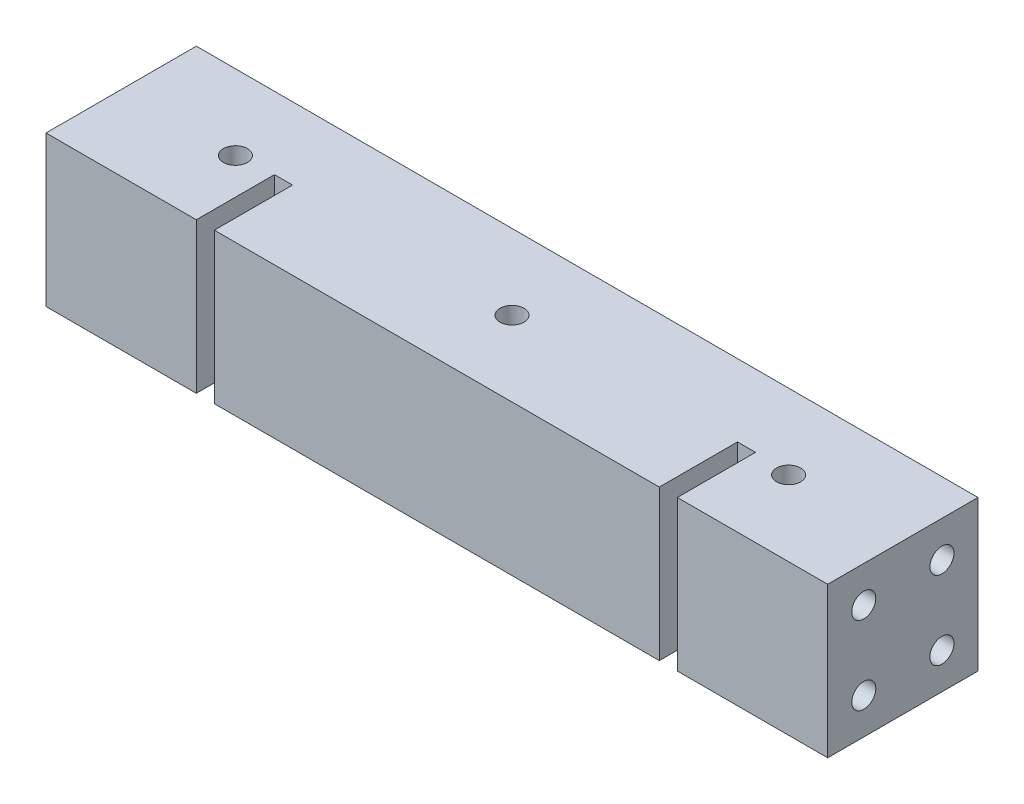
ISO-10303-21;
HEADER;
FILE_DESCRIPTION(('STEP AP214'),'2;1');
FILE_NAME('part.step','',(''),(''),'','','');
FILE_SCHEMA(('AUTOMOTIVE_DESIGN { 1 0 10303 214 1 1 1 1 }'));
ENDSEC;
DATA;
#1=APPLICATION_CONTEXT('core data for automotive mechanical design processes');
#2=APPLICATION_PROTOCOL_DEFINITION('international standard','automotive_design',2000,#1);
#3=PRODUCT_CONTEXT('',#1,'mechanical');
#4=PRODUCT('Part','Part','',(#3));
#5=PRODUCT_RELATED_PRODUCT_CATEGORY('part','',(#4));
#6=PRODUCT_DEFINITION_FORMATION('','',#4);
#7=PRODUCT_DEFINITION_CONTEXT('part definition',#1,'design');
#8=PRODUCT_DEFINITION('design','',#6,#7);
#9=PRODUCT_DEFINITION_SHAPE('','',#8);
#10=(LENGTH_UNIT() NAMED_UNIT(*) SI_UNIT(.MILLI.,.METRE.));
#11=(NAMED_UNIT(*) PLANE_ANGLE_UNIT() SI_UNIT($,.RADIAN.));
#12=(NAMED_UNIT(*) SI_UNIT($,.STERADIAN.) SOLID_ANGLE_UNIT());
#13=UNCERTAINTY_MEASURE_WITH_UNIT(LENGTH_MEASURE(1.E-05),#10,'distance_accuracy_value','');
#14=(GEOMETRIC_REPRESENTATION_CONTEXT(3) GLOBAL_UNCERTAINTY_ASSIGNED_CONTEXT((#13)) GLOBAL_UNIT_ASSIGNED_CONTEXT((#10,
#11,#12)) REPRESENTATION_CONTEXT('',''));
#15=CARTESIAN_POINT('',(0.,0.,0.));
#16=DIRECTION('',(0.,0.,1.));
#17=DIRECTION('',(1.,0.,0.));
#18=AXIS2_PLACEMENT_3D('',#15,#16,#17);
#19=CARTESIAN_POINT('',(0.,12.5,12.5));
#20=DIRECTION('',(0.,0.,-1.));
#21=DIRECTION('',(-1.,0.,0.));
#22=AXIS2_PLACEMENT_3D('',#19,#20,#21);
#23=PLANE('',#22);
#24=DIRECTION('',(1.,0.,0.));
#25=VECTOR('',#24,1.);
#26=CARTESIAN_POINT('',(0.,-12.5,12.5));
#27=LINE('',#26,#25);
#28=CARTESIAN_POINT('',(40.,-12.5,12.5));
#29=VERTEX_POINT('',#28);
#30=CARTESIAN_POINT('',(65.,-12.5,12.5));
#31=VERTEX_POINT('',#30);
#32=EDGE_CURVE('E276',#29,#31,#27,.T.);
#33=ORIENTED_EDGE('',*,*,#32,.T.);
#34=DIRECTION('',(0.,-1.,0.));
#35=VECTOR('',#34,1.);
#36=CARTESIAN_POINT('',(65.,12.5,12.5));
#37=LINE('',#36,#35);
#38=CARTESIAN_POINT('',(65.,12.5,12.5));
#39=VERTEX_POINT('',#38);
#40=EDGE_CURVE('E165',#39,#31,#37,.T.);
#41=ORIENTED_EDGE('',*,*,#40,.F.);
#42=DIRECTION('',(1.,0.,0.));
#43=VECTOR('',#42,1.);
#44=CARTESIAN_POINT('',(0.,12.5,12.5));
#45=LINE('',#44,#43);
#46=CARTESIAN_POINT('',(40.,12.5,12.5));
#47=VERTEX_POINT('',#46);
#48=EDGE_CURVE('E342',#47,#39,#45,.T.);
#49=ORIENTED_EDGE('',*,*,#48,.F.);
#50=DIRECTION('',(0.,-1.,0.));
#51=VECTOR('',#50,1.);
#52=CARTESIAN_POINT('',(40.,12.5,12.5));
#53=LINE('',#52,#51);
#54=EDGE_CURVE('E12',#47,#29,#53,.T.);
#55=ORIENTED_EDGE('',*,*,#54,.T.);
#56=EDGE_LOOP('',(#33,#41,#49,#55));
#57=FACE_BOUND('',#56,.T.);
#58=ADVANCED_FACE('F156',(#57),#23,.F.);
#59=CARTESIAN_POINT('',(65.,12.5,0.));
#60=DIRECTION('',(1.,0.,0.));
#61=DIRECTION('',(0.,0.,-1.));
#62=AXIS2_PLACEMENT_3D('',#59,#60,#61);
#63=PLANE('',#62);
#64=CARTESIAN_POINT('',(65.,-6.5,6.5));
#65=DIRECTION('',(1.,0.,0.));
#66=DIRECTION('',(0.,0.,1.));
#67=AXIS2_PLACEMENT_3D('',#64,#65,#66);
#68=CIRCLE('',#67,2.);
#69=CARTESIAN_POINT('',(65.,-6.5,8.5));
#70=VERTEX_POINT('',#69);
#71=EDGE_CURVE('E821',#70,#70,#68,.T.);
#72=ORIENTED_EDGE('',*,*,#71,.F.);
#73=EDGE_LOOP('',(#72));
#74=FACE_BOUND('',#73,.T.);
#75=CARTESIAN_POINT('',(65.,-6.5,-6.5));
#76=DIRECTION('',(1.,0.,0.));
#77=DIRECTION('',(0.,0.,-1.));
#78=AXIS2_PLACEMENT_3D('',#75,#76,#77);
#79=CIRCLE('',#78,2.);
#80=CARTESIAN_POINT('',(65.,-6.5,-8.5));
#81=VERTEX_POINT('',#80);
#82=EDGE_CURVE('E846',#81,#81,#79,.T.);
#83=ORIENTED_EDGE('',*,*,#82,.F.);
#84=EDGE_LOOP('',(#83));
#85=FACE_BOUND('',#84,.T.);
#86=CARTESIAN_POINT('',(65.,6.5,-6.5));
#87=DIRECTION('',(1.,0.,0.));
#88=DIRECTION('',(0.,0.,1.));
#89=AXIS2_PLACEMENT_3D('',#86,#87,#88);
#90=CIRCLE('',#89,2.);
#91=CARTESIAN_POINT('',(65.,6.5,-4.5));
#92=VERTEX_POINT('',#91);
#93=EDGE_CURVE('E840',#92,#92,#90,.T.);
#94=ORIENTED_EDGE('',*,*,#93,.F.);
#95=EDGE_LOOP('',(#94));
#96=FACE_BOUND('',#95,.T.);
#97=CARTESIAN_POINT('',(65.,6.5,6.5));
#98=DIRECTION('',(1.,0.,0.));
#99=DIRECTION('',(0.,0.,-1.));
#100=AXIS2_PLACEMENT_3D('',#97,#98,#99);
#101=CIRCLE('',#100,2.);
#102=CARTESIAN_POINT('',(65.,6.5,4.5));
#103=VERTEX_POINT('',#102);
#104=EDGE_CURVE('E839',#103,#103,#101,.T.);
#105=ORIENTED_EDGE('',*,*,#104,.F.);
#106=EDGE_LOOP('',(#105));
#107=FACE_BOUND('',#106,.T.);
#108=DIRECTION('',(0.,0.,1.));
#109=VECTOR('',#108,1.);
#110=CARTESIAN_POINT('',(65.,-12.5,0.));
#111=LINE('',#110,#109);
#112=CARTESIAN_POINT('',(65.,-12.5,-12.5));
#113=VERTEX_POINT('',#112);
#114=EDGE_CURVE('E280',#113,#31,#111,.T.);
#115=ORIENTED_EDGE('',*,*,#114,.F.);
#116=DIRECTION('',(0.,-1.,0.));
#117=VECTOR('',#116,1.);
#118=CARTESIAN_POINT('',(65.,12.5,-12.5));
#119=LINE('',#118,#117);
#120=CARTESIAN_POINT('',(65.,12.5,-12.5));
#121=VERTEX_POINT('',#120);
#122=EDGE_CURVE('E321',#121,#113,#119,.T.);
#123=ORIENTED_EDGE('',*,*,#122,.F.);
#124=DIRECTION('',(0.,0.,1.));
#125=VECTOR('',#124,1.);
#126=CARTESIAN_POINT('',(65.,12.5,0.));
#127=LINE('',#126,#125);
#128=EDGE_CURVE('E328',#121,#39,#127,.T.);
#129=ORIENTED_EDGE('',*,*,#128,.T.);
#130=ORIENTED_EDGE('',*,*,#40,.T.);
#131=EDGE_LOOP('',(#115,#123,#129,#130));
#132=FACE_BOUND('',#131,.T.);
#133=ADVANCED_FACE('F326',(#74,#85,#96,#107,#132),#63,.T.);
#134=CARTESIAN_POINT('',(0.,12.5,-12.5));
#135=DIRECTION('',(0.,0.,-1.));
#136=DIRECTION('',(-1.,0.,0.));
#137=AXIS2_PLACEMENT_3D('',#134,#135,#136);
#138=PLANE('',#137);
#139=DIRECTION('',(1.,0.,0.));
#140=VECTOR('',#139,1.);
#141=CARTESIAN_POINT('',(0.,-12.5,-12.5));
#142=LINE('',#141,#140);
#143=CARTESIAN_POINT('',(-65.,-12.5,-12.5));
#144=VERTEX_POINT('',#143);
#145=EDGE_CURVE('E283',#144,#113,#142,.T.);
#146=ORIENTED_EDGE('',*,*,#145,.F.);
#147=DIRECTION('',(0.,-1.,0.));
#148=VECTOR('',#147,1.);
#149=CARTESIAN_POINT('',(-65.,12.5,-12.5));
#150=LINE('',#149,#148);
#151=CARTESIAN_POINT('',(-65.,12.5,-12.5));
#152=VERTEX_POINT('',#151);
#153=EDGE_CURVE('E319',#152,#144,#150,.T.);
#154=ORIENTED_EDGE('',*,*,#153,.F.);
#155=DIRECTION('',(1.,0.,0.));
#156=VECTOR('',#155,1.);
#157=CARTESIAN_POINT('',(0.,12.5,-12.5));
#158=LINE('',#157,#156);
#159=EDGE_CURVE('E341',#152,#121,#158,.T.);
#160=ORIENTED_EDGE('',*,*,#159,.T.);
#161=ORIENTED_EDGE('',*,*,#122,.T.);
#162=EDGE_LOOP('',(#146,#154,#160,#161));
#163=FACE_BOUND('',#162,.T.);
#164=ADVANCED_FACE('F337',(#163),#138,.T.);
#165=CARTESIAN_POINT('',(-65.,12.5,0.));
#166=DIRECTION('',(1.,0.,0.));
#167=DIRECTION('',(0.,0.,-1.));
#168=AXIS2_PLACEMENT_3D('',#165,#166,#167);
#169=PLANE('',#168);
#170=CARTESIAN_POINT('',(-65.,-6.5,6.5));
#171=DIRECTION('',(1.,0.,0.));
#172=DIRECTION('',(0.,0.,1.));
#173=AXIS2_PLACEMENT_3D('',#170,#171,#172);
#174=CIRCLE('',#173,2.);
#175=CARTESIAN_POINT('',(-65.,-6.5,8.5));
#176=VERTEX_POINT('',#175);
#177=EDGE_CURVE('E801',#176,#176,#174,.T.);
#178=ORIENTED_EDGE('',*,*,#177,.T.);
#179=EDGE_LOOP('',(#178));
#180=FACE_BOUND('',#179,.T.);
#181=CARTESIAN_POINT('',(-65.,-6.5,-6.5));
#182=DIRECTION('',(1.,0.,0.));
#183=DIRECTION('',(0.,0.,-1.));
#184=AXIS2_PLACEMENT_3D('',#181,#182,#183);
#185=CIRCLE('',#184,2.);
#186=CARTESIAN_POINT('',(-65.,-6.5,-8.5));
#187=VERTEX_POINT('',#186);
#188=EDGE_CURVE('E800',#187,#187,#185,.T.);
#189=ORIENTED_EDGE('',*,*,#188,.T.);
#190=EDGE_LOOP('',(#189));
#191=FACE_BOUND('',#190,.T.);
#192=CARTESIAN_POINT('',(-65.,6.5,-6.5));
#193=DIRECTION('',(1.,0.,0.));
#194=DIRECTION('',(0.,0.,1.));
#195=AXIS2_PLACEMENT_3D('',#192,#193,#194);
#196=CIRCLE('',#195,2.);
#197=CARTESIAN_POINT('',(-65.,6.5,-4.5));
#198=VERTEX_POINT('',#197);
#199=EDGE_CURVE('E886',#198,#198,#196,.T.);
#200=ORIENTED_EDGE('',*,*,#199,.T.);
#201=EDGE_LOOP('',(#200));
#202=FACE_BOUND('',#201,.T.);
#203=CARTESIAN_POINT('',(-65.,6.5,6.5));
#204=DIRECTION('',(1.,0.,0.));
#205=DIRECTION('',(0.,0.,-1.));
#206=AXIS2_PLACEMENT_3D('',#203,#204,#205);
#207=CIRCLE('',#206,2.);
#208=CARTESIAN_POINT('',(-65.,6.5,4.5));
#209=VERTEX_POINT('',#208);
#210=EDGE_CURVE('E814',#209,#209,#207,.T.);
#211=ORIENTED_EDGE('',*,*,#210,.T.);
#212=EDGE_LOOP('',(#211));
#213=FACE_BOUND('',#212,.T.);
#214=DIRECTION('',(0.,0.,1.));
#215=VECTOR('',#214,1.);
#216=CARTESIAN_POINT('',(-65.,-12.5,0.));
#217=LINE('',#216,#215);
#218=CARTESIAN_POINT('',(-65.,-12.5,12.5));
#219=VERTEX_POINT('',#218);
#220=EDGE_CURVE('E286',#144,#219,#217,.T.);
#221=ORIENTED_EDGE('',*,*,#220,.T.);
#222=DIRECTION('',(0.,-1.,0.));
#223=VECTOR('',#222,1.);
#224=CARTESIAN_POINT('',(-65.,12.5,12.5));
#225=LINE('',#224,#223);
#226=CARTESIAN_POINT('',(-65.,12.5,12.5));
#227=VERTEX_POINT('',#226);
#228=EDGE_CURVE('E316',#227,#219,#225,.T.);
#229=ORIENTED_EDGE('',*,*,#228,.F.);
#230=DIRECTION('',(0.,0.,1.));
#231=VECTOR('',#230,1.);
#232=CARTESIAN_POINT('',(-65.,12.5,0.));
#233=LINE('',#232,#231);
#234=EDGE_CURVE('E344',#152,#227,#233,.T.);
#235=ORIENTED_EDGE('',*,*,#234,.F.);
#236=ORIENTED_EDGE('',*,*,#153,.T.);
#237=EDGE_LOOP('',(#221,#229,#235,#236));
#238=FACE_BOUND('',#237,.T.);
#239=ADVANCED_FACE('F378',(#180,#191,#202,#213,#238),#169,.F.);
#240=CARTESIAN_POINT('',(0.,12.5,12.5));
#241=DIRECTION('',(0.,0.,-1.));
#242=DIRECTION('',(-1.,0.,0.));
#243=AXIS2_PLACEMENT_3D('',#240,#241,#242);
#244=PLANE('',#243);
#245=DIRECTION('',(1.,0.,0.));
#246=VECTOR('',#245,1.);
#247=CARTESIAN_POINT('',(0.,-12.5,12.5));
#248=LINE('',#247,#246);
#249=CARTESIAN_POINT('',(-40.,-12.5,12.5));
#250=VERTEX_POINT('',#249);
#251=EDGE_CURVE('E288',#219,#250,#248,.T.);
#252=ORIENTED_EDGE('',*,*,#251,.T.);
#253=DIRECTION('',(0.,-1.,0.));
#254=VECTOR('',#253,1.);
#255=CARTESIAN_POINT('',(-40.,12.5,12.5));
#256=LINE('',#255,#254);
#257=CARTESIAN_POINT('',(-40.,12.5,12.5));
#258=VERTEX_POINT('',#257);
#259=EDGE_CURVE('E313',#258,#250,#256,.T.);
#260=ORIENTED_EDGE('',*,*,#259,.F.);
#261=DIRECTION('',(1.,0.,0.));
#262=VECTOR('',#261,1.);
#263=CARTESIAN_POINT('',(0.,12.5,12.5));
#264=LINE('',#263,#262);
#265=EDGE_CURVE('E350',#227,#258,#264,.T.);
#266=ORIENTED_EDGE('',*,*,#265,.F.);
#267=ORIENTED_EDGE('',*,*,#228,.T.);
#268=EDGE_LOOP('',(#252,#260,#266,#267));
#269=FACE_BOUND('',#268,.T.);
#270=ADVANCED_FACE('F381',(#269),#244,.F.);
#271=CARTESIAN_POINT('',(-40.,12.5,0.));
#272=DIRECTION('',(-1.,0.,0.));
#273=DIRECTION('',(0.,0.,1.));
#274=AXIS2_PLACEMENT_3D('',#271,#272,#273);
#275=PLANE('',#274);
#276=DIRECTION('',(0.,0.,-1.));
#277=VECTOR('',#276,1.);
#278=CARTESIAN_POINT('',(-40.,-12.5,0.));
#279=LINE('',#278,#277);
#280=CARTESIAN_POINT('',(-40.,-12.5,-0.499999999999999));
#281=VERTEX_POINT('',#280);
#282=EDGE_CURVE('E290',#250,#281,#279,.T.);
#283=ORIENTED_EDGE('',*,*,#282,.T.);
#284=DIRECTION('',(0.,-1.,0.));
#285=VECTOR('',#284,1.);
#286=CARTESIAN_POINT('',(-40.,12.5,-0.499999999999999));
#287=LINE('',#286,#285);
#288=CARTESIAN_POINT('',(-40.,12.5,-0.499999999999999));
#289=VERTEX_POINT('',#288);
#290=EDGE_CURVE('E310',#289,#281,#287,.T.);
#291=ORIENTED_EDGE('',*,*,#290,.F.);
#292=DIRECTION('',(0.,0.,-1.));
#293=VECTOR('',#292,1.);
#294=CARTESIAN_POINT('',(-40.,12.5,0.));
#295=LINE('',#294,#293);
#296=EDGE_CURVE('E352',#258,#289,#295,.T.);
#297=ORIENTED_EDGE('',*,*,#296,.F.);
#298=ORIENTED_EDGE('',*,*,#259,.T.);
#299=EDGE_LOOP('',(#283,#291,#297,#298));
#300=FACE_BOUND('',#299,.T.);
#301=ADVANCED_FACE('F385',(#300),#275,.F.);
#302=CARTESIAN_POINT('',(0.,12.5,-0.499999999999999));
#303=DIRECTION('',(0.,0.,-1.));
#304=DIRECTION('',(-1.,0.,0.));
#305=AXIS2_PLACEMENT_3D('',#302,#303,#304);
#306=PLANE('',#305);
#307=DIRECTION('',(1.,0.,0.));
#308=VECTOR('',#307,1.);
#309=CARTESIAN_POINT('',(0.,-12.5,-0.499999999999999));
#310=LINE('',#309,#308);
#311=CARTESIAN_POINT('',(-37.,-12.5,-0.499999999999999));
#312=VERTEX_POINT('',#311);
#313=EDGE_CURVE('E292',#281,#312,#310,.T.);
#314=ORIENTED_EDGE('',*,*,#313,.T.);
#315=DIRECTION('',(0.,-1.,0.));
#316=VECTOR('',#315,1.);
#317=CARTESIAN_POINT('',(-37.,12.5,-0.499999999999999));
#318=LINE('',#317,#316);
#319=CARTESIAN_POINT('',(-37.,12.5,-0.499999999999999));
#320=VERTEX_POINT('',#319);
#321=EDGE_CURVE('E308',#320,#312,#318,.T.);
#322=ORIENTED_EDGE('',*,*,#321,.F.);
#323=DIRECTION('',(1.,0.,0.));
#324=VECTOR('',#323,1.);
#325=CARTESIAN_POINT('',(0.,12.5,-0.499999999999999));
#326=LINE('',#325,#324);
#327=EDGE_CURVE('E354',#289,#320,#326,.T.);
#328=ORIENTED_EDGE('',*,*,#327,.F.);
#329=ORIENTED_EDGE('',*,*,#290,.T.);
#330=EDGE_LOOP('',(#314,#322,#328,#329));
#331=FACE_BOUND('',#330,.T.);
#332=ADVANCED_FACE('F389',(#331),#306,.F.);
#333=CARTESIAN_POINT('',(-37.,12.5,0.));
#334=DIRECTION('',(-1.,0.,0.));
#335=DIRECTION('',(0.,0.,1.));
#336=AXIS2_PLACEMENT_3D('',#333,#334,#335);
#337=PLANE('',#336);
#338=DIRECTION('',(0.,0.,-1.));
#339=VECTOR('',#338,1.);
#340=CARTESIAN_POINT('',(-37.,-12.5,0.));
#341=LINE('',#340,#339);
#342=CARTESIAN_POINT('',(-37.,-12.5,12.5));
#343=VERTEX_POINT('',#342);
#344=EDGE_CURVE('E295',#343,#312,#341,.T.);
#345=ORIENTED_EDGE('',*,*,#344,.F.);
#346=DIRECTION('',(0.,-1.,0.));
#347=VECTOR('',#346,1.);
#348=CARTESIAN_POINT('',(-37.,12.5,12.5));
#349=LINE('',#348,#347);
#350=CARTESIAN_POINT('',(-37.,12.5,12.5));
#351=VERTEX_POINT('',#350);
#352=EDGE_CURVE('E266',#351,#343,#349,.T.);
#353=ORIENTED_EDGE('',*,*,#352,.F.);
#354=DIRECTION('',(0.,0.,-1.));
#355=VECTOR('',#354,1.);
#356=CARTESIAN_POINT('',(-37.,12.5,0.));
#357=LINE('',#356,#355);
#358=EDGE_CURVE('E256',#351,#320,#357,.T.);
#359=ORIENTED_EDGE('',*,*,#358,.T.);
#360=ORIENTED_EDGE('',*,*,#321,.T.);
#361=EDGE_LOOP('',(#345,#353,#359,#360));
#362=FACE_BOUND('',#361,.T.);
#363=ADVANCED_FACE('F357',(#362),#337,.T.);
#364=CARTESIAN_POINT('',(0.,12.5,12.5));
#365=DIRECTION('',(0.,0.,-1.));
#366=DIRECTION('',(-1.,0.,0.));
#367=AXIS2_PLACEMENT_3D('',#364,#365,#366);
#368=PLANE('',#367);
#369=DIRECTION('',(1.,0.,0.));
#370=VECTOR('',#369,1.);
#371=CARTESIAN_POINT('',(0.,-12.5,12.5));
#372=LINE('',#371,#370);
#373=CARTESIAN_POINT('',(37.,-12.5,12.5));
#374=VERTEX_POINT('',#373);
#375=EDGE_CURVE('E263',#343,#374,#372,.T.);
#376=ORIENTED_EDGE('',*,*,#375,.T.);
#377=DIRECTION('',(0.,-1.,0.));
#378=VECTOR('',#377,1.);
#379=CARTESIAN_POINT('',(37.,12.5,12.5));
#380=LINE('',#379,#378);
#381=CARTESIAN_POINT('',(37.,12.5,12.5));
#382=VERTEX_POINT('',#381);
#383=EDGE_CURVE('E260',#382,#374,#380,.T.);
#384=ORIENTED_EDGE('',*,*,#383,.F.);
#385=DIRECTION('',(1.,0.,0.));
#386=VECTOR('',#385,1.);
#387=CARTESIAN_POINT('',(0.,12.5,12.5));
#388=LINE('',#387,#386);
#389=EDGE_CURVE('E248',#351,#382,#388,.T.);
#390=ORIENTED_EDGE('',*,*,#389,.F.);
#391=ORIENTED_EDGE('',*,*,#352,.T.);
#392=EDGE_LOOP('',(#376,#384,#390,#391));
#393=FACE_BOUND('',#392,.T.);
#394=ADVANCED_FACE('F261',(#393),#368,.F.);
#395=CARTESIAN_POINT('',(37.,12.5,0.));
#396=DIRECTION('',(-1.,0.,0.));
#397=DIRECTION('',(0.,0.,1.));
#398=AXIS2_PLACEMENT_3D('',#395,#396,#397);
#399=PLANE('',#398);
#400=DIRECTION('',(0.,0.,-1.));
#401=VECTOR('',#400,1.);
#402=CARTESIAN_POINT('',(37.,-12.5,0.));
#403=LINE('',#402,#401);
#404=CARTESIAN_POINT('',(37.,-12.5,-0.499999999999999));
#405=VERTEX_POINT('',#404);
#406=EDGE_CURVE('E299',#374,#405,#403,.T.);
#407=ORIENTED_EDGE('',*,*,#406,.T.);
#408=DIRECTION('',(0.,-1.,0.));
#409=VECTOR('',#408,1.);
#410=CARTESIAN_POINT('',(37.,12.5,-0.499999999999999));
#411=LINE('',#410,#409);
#412=CARTESIAN_POINT('',(37.,12.5,-0.499999999999999));
#413=VERTEX_POINT('',#412);
#414=EDGE_CURVE('E211',#413,#405,#411,.T.);
#415=ORIENTED_EDGE('',*,*,#414,.F.);
#416=DIRECTION('',(0.,0.,-1.));
#417=VECTOR('',#416,1.);
#418=CARTESIAN_POINT('',(37.,12.5,0.));
#419=LINE('',#418,#417);
#420=EDGE_CURVE('E254',#382,#413,#419,.T.);
#421=ORIENTED_EDGE('',*,*,#420,.F.);
#422=ORIENTED_EDGE('',*,*,#383,.T.);
#423=EDGE_LOOP('',(#407,#415,#421,#422));
#424=FACE_BOUND('',#423,.T.);
#425=ADVANCED_FACE('F268',(#424),#399,.F.);
#426=CARTESIAN_POINT('',(0.,12.5,-0.499999999999999));
#427=DIRECTION('',(0.,0.,1.));
#428=DIRECTION('',(1.,0.,0.));
#429=AXIS2_PLACEMENT_3D('',#426,#427,#428);
#430=PLANE('',#429);
#431=DIRECTION('',(-1.,0.,0.));
#432=VECTOR('',#431,1.);
#433=CARTESIAN_POINT('',(0.,-12.5,-0.499999999999999));
#434=LINE('',#433,#432);
#435=CARTESIAN_POINT('',(40.,-12.5,-0.499999999999999));
#436=VERTEX_POINT('',#435);
#437=EDGE_CURVE('E301',#436,#405,#434,.T.);
#438=ORIENTED_EDGE('',*,*,#437,.F.);
#439=DIRECTION('',(0.,-1.,0.));
#440=VECTOR('',#439,1.);
#441=CARTESIAN_POINT('',(40.,12.5,-0.499999999999999));
#442=LINE('',#441,#440);
#443=CARTESIAN_POINT('',(40.,12.5,-0.499999999999999));
#444=VERTEX_POINT('',#443);
#445=EDGE_CURVE('E173',#444,#436,#442,.T.);
#446=ORIENTED_EDGE('',*,*,#445,.F.);
#447=DIRECTION('',(-1.,0.,0.));
#448=VECTOR('',#447,1.);
#449=CARTESIAN_POINT('',(0.,12.5,-0.499999999999999));
#450=LINE('',#449,#448);
#451=EDGE_CURVE('E269',#444,#413,#450,.T.);
#452=ORIENTED_EDGE('',*,*,#451,.T.);
#453=ORIENTED_EDGE('',*,*,#414,.T.);
#454=EDGE_LOOP('',(#438,#446,#452,#453));
#455=FACE_BOUND('',#454,.T.);
#456=ADVANCED_FACE('F360',(#455),#430,.T.);
#457=CARTESIAN_POINT('',(40.,12.5,0.));
#458=DIRECTION('',(-1.,0.,0.));
#459=DIRECTION('',(0.,0.,1.));
#460=AXIS2_PLACEMENT_3D('',#457,#458,#459);
#461=PLANE('',#460);
#462=DIRECTION('',(0.,0.,-1.));
#463=VECTOR('',#462,1.);
#464=CARTESIAN_POINT('',(40.,-12.5,0.));
#465=LINE('',#464,#463);
#466=EDGE_CURVE('E274',#29,#436,#465,.T.);
#467=ORIENTED_EDGE('',*,*,#466,.F.);
#468=ORIENTED_EDGE('',*,*,#54,.F.);
#469=DIRECTION('',(0.,0.,-1.));
#470=VECTOR('',#469,1.);
#471=CARTESIAN_POINT('',(40.,12.5,0.));
#472=LINE('',#471,#470);
#473=EDGE_CURVE('E304',#47,#444,#472,.T.);
#474=ORIENTED_EDGE('',*,*,#473,.T.);
#475=ORIENTED_EDGE('',*,*,#445,.T.);
#476=EDGE_LOOP('',(#467,#468,#474,#475));
#477=FACE_BOUND('',#476,.T.);
#478=ADVANCED_FACE('F158',(#477),#461,.T.);
#479=CARTESIAN_POINT('',(0.,-12.5,0.));
#480=DIRECTION('',(0.,1.,0.));
#481=DIRECTION('',(0.,0.,1.));
#482=AXIS2_PLACEMENT_3D('',#479,#480,#481);
#483=PLANE('',#482);
#484=ORIENTED_EDGE('',*,*,#466,.T.);
#485=ORIENTED_EDGE('',*,*,#437,.T.);
#486=ORIENTED_EDGE('',*,*,#406,.F.);
#487=ORIENTED_EDGE('',*,*,#375,.F.);
#488=ORIENTED_EDGE('',*,*,#344,.T.);
#489=ORIENTED_EDGE('',*,*,#313,.F.);
#490=ORIENTED_EDGE('',*,*,#282,.F.);
#491=ORIENTED_EDGE('',*,*,#251,.F.);
#492=ORIENTED_EDGE('',*,*,#220,.F.);
#493=ORIENTED_EDGE('',*,*,#145,.T.);
#494=ORIENTED_EDGE('',*,*,#114,.T.);
#495=ORIENTED_EDGE('',*,*,#32,.F.);
#496=EDGE_LOOP('',(#484,#485,#486,#487,#488,#489,#490,#491,#492,#493,#494,#495));
#497=FACE_BOUND('',#496,.T.);
#498=ADVANCED_FACE('F332',(#497),#483,.F.);
#499=CARTESIAN_POINT('',(0.,12.5,0.));
#500=DIRECTION('',(0.,1.,0.));
#501=DIRECTION('',(0.,0.,1.));
#502=AXIS2_PLACEMENT_3D('',#499,#500,#501);
#503=PLANE('',#502);
#504=CARTESIAN_POINT('',(46.,12.5,0.));
#505=DIRECTION('',(0.,1.,0.));
#506=DIRECTION('',(0.,0.,1.));
#507=AXIS2_PLACEMENT_3D('',#504,#505,#506);
#508=CIRCLE('',#507,2.);
#509=CARTESIAN_POINT('',(46.,12.5,2.));
#510=VERTEX_POINT('',#509);
#511=EDGE_CURVE('E822',#510,#510,#508,.T.);
#512=ORIENTED_EDGE('',*,*,#511,.F.);
#513=EDGE_LOOP('',(#512));
#514=FACE_BOUND('',#513,.T.);
#515=CARTESIAN_POINT('',(0.,12.5,0.));
#516=DIRECTION('',(0.,1.,0.));
#517=DIRECTION('',(0.,0.,1.));
#518=AXIS2_PLACEMENT_3D('',#515,#516,#517);
#519=CIRCLE('',#518,2.);
#520=CARTESIAN_POINT('',(0.,12.5,2.));
#521=VERTEX_POINT('',#520);
#522=EDGE_CURVE('E828',#521,#521,#519,.T.);
#523=ORIENTED_EDGE('',*,*,#522,.F.);
#524=EDGE_LOOP('',(#523));
#525=FACE_BOUND('',#524,.T.);
#526=CARTESIAN_POINT('',(-46.,12.5,0.));
#527=DIRECTION('',(0.,1.,0.));
#528=DIRECTION('',(0.,0.,1.));
#529=AXIS2_PLACEMENT_3D('',#526,#527,#528);
#530=CIRCLE('',#529,2.);
#531=CARTESIAN_POINT('',(-46.,12.5,2.));
#532=VERTEX_POINT('',#531);
#533=EDGE_CURVE('E813',#532,#532,#530,.T.);
#534=ORIENTED_EDGE('',*,*,#533,.F.);
#535=EDGE_LOOP('',(#534));
#536=FACE_BOUND('',#535,.T.);
#537=ORIENTED_EDGE('',*,*,#473,.F.);
#538=ORIENTED_EDGE('',*,*,#48,.T.);
#539=ORIENTED_EDGE('',*,*,#128,.F.);
#540=ORIENTED_EDGE('',*,*,#159,.F.);
#541=ORIENTED_EDGE('',*,*,#234,.T.);
#542=ORIENTED_EDGE('',*,*,#265,.T.);
#543=ORIENTED_EDGE('',*,*,#296,.T.);
#544=ORIENTED_EDGE('',*,*,#327,.T.);
#545=ORIENTED_EDGE('',*,*,#358,.F.);
#546=ORIENTED_EDGE('',*,*,#389,.T.);
#547=ORIENTED_EDGE('',*,*,#420,.T.);
#548=ORIENTED_EDGE('',*,*,#451,.F.);
#549=EDGE_LOOP('',(#537,#538,#539,#540,#541,#542,#543,#544,#545,#546,#547,#548));
#550=FACE_BOUND('',#549,.T.);
#551=ADVANCED_FACE('F251',(#514,#525,#536,#550),#503,.T.);
#552=CARTESIAN_POINT('',(50.,6.5,6.5));
#553=DIRECTION('',(1.,0.,0.));
#554=DIRECTION('',(0.,0.,-1.));
#555=AXIS2_PLACEMENT_3D('',#552,#553,#554);
#556=CYLINDRICAL_SURFACE('',#555,2.);
#557=CARTESIAN_POINT('',(50.,6.5,6.5));
#558=DIRECTION('',(1.,0.,0.));
#559=DIRECTION('',(0.,0.,-1.));
#560=AXIS2_PLACEMENT_3D('',#557,#558,#559);
#561=CIRCLE('',#560,2.);
#562=CARTESIAN_POINT('',(50.,6.5,4.5));
#563=VERTEX_POINT('',#562);
#564=EDGE_CURVE('E277',#563,#563,#561,.T.);
#565=ORIENTED_EDGE('',*,*,#564,.F.);
#566=EDGE_LOOP('',(#565));
#567=FACE_BOUND('',#566,.T.);
#568=ORIENTED_EDGE('',*,*,#104,.T.);
#569=EDGE_LOOP('',(#568));
#570=FACE_BOUND('',#569,.T.);
#571=ADVANCED_FACE('F441',(#567,#570),#556,.F.);
#572=CARTESIAN_POINT('',(50.,6.5,6.5));
#573=DIRECTION('',(1.,0.,0.));
#574=DIRECTION('',(0.,0.,-1.));
#575=AXIS2_PLACEMENT_3D('',#572,#573,#574);
#576=PLANE('',#575);
#577=ORIENTED_EDGE('',*,*,#564,.T.);
#578=EDGE_LOOP('',(#577));
#579=FACE_BOUND('',#578,.T.);
#580=ADVANCED_FACE('F446',(#579),#576,.T.);
#581=CARTESIAN_POINT('',(50.,6.5,-6.5));
#582=DIRECTION('',(1.,0.,0.));
#583=DIRECTION('',(0.,0.,-1.));
#584=AXIS2_PLACEMENT_3D('',#581,#582,#583);
#585=CYLINDRICAL_SURFACE('',#584,2.);
#586=CARTESIAN_POINT('',(50.,6.5,-6.5));
#587=DIRECTION('',(1.,0.,0.));
#588=DIRECTION('',(0.,0.,1.));
#589=AXIS2_PLACEMENT_3D('',#586,#587,#588);
#590=CIRCLE('',#589,2.);
#591=CARTESIAN_POINT('',(50.,6.5,-4.5));
#592=VERTEX_POINT('',#591);
#593=EDGE_CURVE('E836',#592,#592,#590,.T.);
#594=ORIENTED_EDGE('',*,*,#593,.F.);
#595=EDGE_LOOP('',(#594));
#596=FACE_BOUND('',#595,.T.);
#597=ORIENTED_EDGE('',*,*,#93,.T.);
#598=EDGE_LOOP('',(#597));
#599=FACE_BOUND('',#598,.T.);
#600=ADVANCED_FACE('F458',(#596,#599),#585,.F.);
#601=CARTESIAN_POINT('',(50.,6.5,-6.5));
#602=DIRECTION('',(-1.,0.,0.));
#603=DIRECTION('',(0.,0.,1.));
#604=AXIS2_PLACEMENT_3D('',#601,#602,#603);
#605=PLANE('',#604);
#606=ORIENTED_EDGE('',*,*,#593,.T.);
#607=EDGE_LOOP('',(#606));
#608=FACE_BOUND('',#607,.T.);
#609=ADVANCED_FACE('F468',(#608),#605,.F.);
#610=CARTESIAN_POINT('',(50.,-6.5,-6.5));
#611=DIRECTION('',(1.,0.,0.));
#612=DIRECTION('',(0.,0.,-1.));
#613=AXIS2_PLACEMENT_3D('',#610,#611,#612);
#614=CYLINDRICAL_SURFACE('',#613,2.);
#615=CARTESIAN_POINT('',(50.,-6.5,-6.5));
#616=DIRECTION('',(1.,0.,0.));
#617=DIRECTION('',(0.,0.,-1.));
#618=AXIS2_PLACEMENT_3D('',#615,#616,#617);
#619=CIRCLE('',#618,2.);
#620=CARTESIAN_POINT('',(50.,-6.5,-8.5));
#621=VERTEX_POINT('',#620);
#622=EDGE_CURVE('E843',#621,#621,#619,.T.);
#623=ORIENTED_EDGE('',*,*,#622,.F.);
#624=EDGE_LOOP('',(#623));
#625=FACE_BOUND('',#624,.T.);
#626=ORIENTED_EDGE('',*,*,#82,.T.);
#627=EDGE_LOOP('',(#626));
#628=FACE_BOUND('',#627,.T.);
#629=ADVANCED_FACE('F479',(#625,#628),#614,.F.);
#630=CARTESIAN_POINT('',(50.,-6.5,-6.5));
#631=DIRECTION('',(1.,0.,0.));
#632=DIRECTION('',(0.,0.,-1.));
#633=AXIS2_PLACEMENT_3D('',#630,#631,#632);
#634=PLANE('',#633);
#635=ORIENTED_EDGE('',*,*,#622,.T.);
#636=EDGE_LOOP('',(#635));
#637=FACE_BOUND('',#636,.T.);
#638=ADVANCED_FACE('F490',(#637),#634,.T.);
#639=CARTESIAN_POINT('',(50.,-6.5,6.5));
#640=DIRECTION('',(1.,0.,0.));
#641=DIRECTION('',(0.,0.,-1.));
#642=AXIS2_PLACEMENT_3D('',#639,#640,#641);
#643=CYLINDRICAL_SURFACE('',#642,2.);
#644=CARTESIAN_POINT('',(50.,-6.5,6.5));
#645=DIRECTION('',(1.,0.,0.));
#646=DIRECTION('',(0.,0.,1.));
#647=AXIS2_PLACEMENT_3D('',#644,#645,#646);
#648=CIRCLE('',#647,2.);
#649=CARTESIAN_POINT('',(50.,-6.5,8.5));
#650=VERTEX_POINT('',#649);
#651=EDGE_CURVE('E849',#650,#650,#648,.T.);
#652=ORIENTED_EDGE('',*,*,#651,.F.);
#653=EDGE_LOOP('',(#652));
#654=FACE_BOUND('',#653,.T.);
#655=ORIENTED_EDGE('',*,*,#71,.T.);
#656=EDGE_LOOP('',(#655));
#657=FACE_BOUND('',#656,.T.);
#658=ADVANCED_FACE('F503',(#654,#657),#643,.F.);
#659=CARTESIAN_POINT('',(50.,-6.5,6.5));
#660=DIRECTION('',(-1.,0.,0.));
#661=DIRECTION('',(0.,0.,1.));
#662=AXIS2_PLACEMENT_3D('',#659,#660,#661);
#663=PLANE('',#662);
#664=ORIENTED_EDGE('',*,*,#651,.T.);
#665=EDGE_LOOP('',(#664));
#666=FACE_BOUND('',#665,.T.);
#667=ADVANCED_FACE('F514',(#666),#663,.F.);
#668=CARTESIAN_POINT('',(-46.,-2.5,0.));
#669=DIRECTION('',(0.,1.,0.));
#670=DIRECTION('',(0.,0.,1.));
#671=AXIS2_PLACEMENT_3D('',#668,#669,#670);
#672=CYLINDRICAL_SURFACE('',#671,2.);
#673=CARTESIAN_POINT('',(-46.,-2.5,0.));
#674=DIRECTION('',(0.,1.,0.));
#675=DIRECTION('',(0.,0.,1.));
#676=AXIS2_PLACEMENT_3D('',#673,#674,#675);
#677=CIRCLE('',#676,2.);
#678=CARTESIAN_POINT('',(-46.,-2.5,2.));
#679=VERTEX_POINT('',#678);
#680=EDGE_CURVE('E831',#679,#679,#677,.T.);
#681=ORIENTED_EDGE('',*,*,#680,.F.);
#682=EDGE_LOOP('',(#681));
#683=FACE_BOUND('',#682,.T.);
#684=ORIENTED_EDGE('',*,*,#533,.T.);
#685=EDGE_LOOP('',(#684));
#686=FACE_BOUND('',#685,.T.);
#687=ADVANCED_FACE('F525',(#683,#686),#672,.F.);
#688=CARTESIAN_POINT('',(-46.,-2.5,0.));
#689=DIRECTION('',(0.,1.,0.));
#690=DIRECTION('',(0.,0.,1.));
#691=AXIS2_PLACEMENT_3D('',#688,#689,#690);
#692=PLANE('',#691);
#693=ORIENTED_EDGE('',*,*,#680,.T.);
#694=EDGE_LOOP('',(#693));
#695=FACE_BOUND('',#694,.T.);
#696=ADVANCED_FACE('F547',(#695),#692,.T.);
#697=CARTESIAN_POINT('',(0.,-2.5,0.));
#698=DIRECTION('',(0.,1.,0.));
#699=DIRECTION('',(0.,0.,1.));
#700=AXIS2_PLACEMENT_3D('',#697,#698,#699);
#701=CYLINDRICAL_SURFACE('',#700,2.);
#702=CARTESIAN_POINT('',(0.,-2.5,0.));
#703=DIRECTION('',(0.,1.,0.));
#704=DIRECTION('',(0.,0.,1.));
#705=AXIS2_PLACEMENT_3D('',#702,#703,#704);
#706=CIRCLE('',#705,2.);
#707=CARTESIAN_POINT('',(0.,-2.5,2.));
#708=VERTEX_POINT('',#707);
#709=EDGE_CURVE('E825',#708,#708,#706,.T.);
#710=ORIENTED_EDGE('',*,*,#709,.F.);
#711=EDGE_LOOP('',(#710));
#712=FACE_BOUND('',#711,.T.);
#713=ORIENTED_EDGE('',*,*,#522,.T.);
#714=EDGE_LOOP('',(#713));
#715=FACE_BOUND('',#714,.T.);
#716=ADVANCED_FACE('F559',(#712,#715),#701,.F.);
#717=CARTESIAN_POINT('',(0.,-2.5,0.));
#718=DIRECTION('',(0.,1.,0.));
#719=DIRECTION('',(0.,0.,1.));
#720=AXIS2_PLACEMENT_3D('',#717,#718,#719);
#721=PLANE('',#720);
#722=ORIENTED_EDGE('',*,*,#709,.T.);
#723=EDGE_LOOP('',(#722));
#724=FACE_BOUND('',#723,.T.);
#725=ADVANCED_FACE('F569',(#724),#721,.T.);
#726=CARTESIAN_POINT('',(46.,-2.5,0.));
#727=DIRECTION('',(0.,1.,0.));
#728=DIRECTION('',(0.,0.,1.));
#729=AXIS2_PLACEMENT_3D('',#726,#727,#728);
#730=CYLINDRICAL_SURFACE('',#729,2.);
#731=CARTESIAN_POINT('',(46.,-2.5,0.));
#732=DIRECTION('',(0.,1.,0.));
#733=DIRECTION('',(0.,0.,1.));
#734=AXIS2_PLACEMENT_3D('',#731,#732,#733);
#735=CIRCLE('',#734,2.);
#736=CARTESIAN_POINT('',(46.,-2.5,2.));
#737=VERTEX_POINT('',#736);
#738=EDGE_CURVE('E818',#737,#737,#735,.T.);
#739=ORIENTED_EDGE('',*,*,#738,.F.);
#740=EDGE_LOOP('',(#739));
#741=FACE_BOUND('',#740,.T.);
#742=ORIENTED_EDGE('',*,*,#511,.T.);
#743=EDGE_LOOP('',(#742));
#744=FACE_BOUND('',#743,.T.);
#745=ADVANCED_FACE('F580',(#741,#744),#730,.F.);
#746=CARTESIAN_POINT('',(46.,-2.5,0.));
#747=DIRECTION('',(0.,1.,0.));
#748=DIRECTION('',(0.,0.,1.));
#749=AXIS2_PLACEMENT_3D('',#746,#747,#748);
#750=PLANE('',#749);
#751=ORIENTED_EDGE('',*,*,#738,.T.);
#752=EDGE_LOOP('',(#751));
#753=FACE_BOUND('',#752,.T.);
#754=ADVANCED_FACE('F590',(#753),#750,.T.);
#755=CARTESIAN_POINT('',(-50.,6.5,6.5));
#756=DIRECTION('',(-1.,0.,0.));
#757=DIRECTION('',(0.,0.,1.));
#758=AXIS2_PLACEMENT_3D('',#755,#756,#757);
#759=CYLINDRICAL_SURFACE('',#758,2.);
#760=CARTESIAN_POINT('',(-50.,6.5,6.5));
#761=DIRECTION('',(1.,0.,0.));
#762=DIRECTION('',(0.,0.,-1.));
#763=AXIS2_PLACEMENT_3D('',#760,#761,#762);
#764=CIRCLE('',#763,2.);
#765=CARTESIAN_POINT('',(-50.,6.5,4.5));
#766=VERTEX_POINT('',#765);
#767=EDGE_CURVE('E810',#766,#766,#764,.T.);
#768=ORIENTED_EDGE('',*,*,#767,.T.);
#769=EDGE_LOOP('',(#768));
#770=FACE_BOUND('',#769,.T.);
#771=ORIENTED_EDGE('',*,*,#210,.F.);
#772=EDGE_LOOP('',(#771));
#773=FACE_BOUND('',#772,.T.);
#774=ADVANCED_FACE('F602',(#770,#773),#759,.F.);
#775=CARTESIAN_POINT('',(-50.,6.5,6.5));
#776=DIRECTION('',(-1.,0.,0.));
#777=DIRECTION('',(0.,0.,-1.));
#778=AXIS2_PLACEMENT_3D('',#775,#776,#777);
#779=PLANE('',#778);
#780=ORIENTED_EDGE('',*,*,#767,.F.);
#781=EDGE_LOOP('',(#780));
#782=FACE_BOUND('',#781,.T.);
#783=ADVANCED_FACE('F621',(#782),#779,.T.);
#784=CARTESIAN_POINT('',(-50.,6.5,-6.5));
#785=DIRECTION('',(-1.,0.,0.));
#786=DIRECTION('',(0.,0.,1.));
#787=AXIS2_PLACEMENT_3D('',#784,#785,#786);
#788=CYLINDRICAL_SURFACE('',#787,2.);
#789=CARTESIAN_POINT('',(-50.,6.5,-6.5));
#790=DIRECTION('',(1.,0.,0.));
#791=DIRECTION('',(0.,0.,1.));
#792=AXIS2_PLACEMENT_3D('',#789,#790,#791);
#793=CIRCLE('',#792,2.);
#794=CARTESIAN_POINT('',(-50.,6.5,-4.5));
#795=VERTEX_POINT('',#794);
#796=EDGE_CURVE('E817',#795,#795,#793,.T.);
#797=ORIENTED_EDGE('',*,*,#796,.T.);
#798=EDGE_LOOP('',(#797));
#799=FACE_BOUND('',#798,.T.);
#800=ORIENTED_EDGE('',*,*,#199,.F.);
#801=EDGE_LOOP('',(#800));
#802=FACE_BOUND('',#801,.T.);
#803=ADVANCED_FACE('F633',(#799,#802),#788,.F.);
#804=CARTESIAN_POINT('',(-50.,6.5,-6.5));
#805=DIRECTION('',(1.,0.,0.));
#806=DIRECTION('',(0.,0.,1.));
#807=AXIS2_PLACEMENT_3D('',#804,#805,#806);
#808=PLANE('',#807);
#809=ORIENTED_EDGE('',*,*,#796,.F.);
#810=EDGE_LOOP('',(#809));
#811=FACE_BOUND('',#810,.T.);
#812=ADVANCED_FACE('F643',(#811),#808,.F.);
#813=CARTESIAN_POINT('',(-50.,-6.5,-6.5));
#814=DIRECTION('',(-1.,0.,0.));
#815=DIRECTION('',(0.,0.,1.));
#816=AXIS2_PLACEMENT_3D('',#813,#814,#815);
#817=CYLINDRICAL_SURFACE('',#816,2.);
#818=CARTESIAN_POINT('',(-50.,-6.5,-6.5));
#819=DIRECTION('',(1.,0.,0.));
#820=DIRECTION('',(0.,0.,-1.));
#821=AXIS2_PLACEMENT_3D('',#818,#819,#820);
#822=CIRCLE('',#821,2.);
#823=CARTESIAN_POINT('',(-50.,-6.5,-8.5));
#824=VERTEX_POINT('',#823);
#825=EDGE_CURVE('E804',#824,#824,#822,.T.);
#826=ORIENTED_EDGE('',*,*,#825,.T.);
#827=EDGE_LOOP('',(#826));
#828=FACE_BOUND('',#827,.T.);
#829=ORIENTED_EDGE('',*,*,#188,.F.);
#830=EDGE_LOOP('',(#829));
#831=FACE_BOUND('',#830,.T.);
#832=ADVANCED_FACE('F654',(#828,#831),#817,.F.);
#833=CARTESIAN_POINT('',(-50.,-6.5,-6.5));
#834=DIRECTION('',(-1.,0.,0.));
#835=DIRECTION('',(0.,0.,-1.));
#836=AXIS2_PLACEMENT_3D('',#833,#834,#835);
#837=PLANE('',#836);
#838=ORIENTED_EDGE('',*,*,#825,.F.);
#839=EDGE_LOOP('',(#838));
#840=FACE_BOUND('',#839,.T.);
#841=ADVANCED_FACE('F664',(#840),#837,.T.);
#842=CARTESIAN_POINT('',(-50.,-6.5,6.5));
#843=DIRECTION('',(-1.,0.,0.));
#844=DIRECTION('',(0.,0.,1.));
#845=AXIS2_PLACEMENT_3D('',#842,#843,#844);
#846=CYLINDRICAL_SURFACE('',#845,2.);
#847=CARTESIAN_POINT('',(-50.,-6.5,6.5));
#848=DIRECTION('',(1.,0.,0.));
#849=DIRECTION('',(0.,0.,1.));
#850=AXIS2_PLACEMENT_3D('',#847,#848,#849);
#851=CIRCLE('',#850,2.);
#852=CARTESIAN_POINT('',(-50.,-6.5,8.5));
#853=VERTEX_POINT('',#852);
#854=EDGE_CURVE('E799',#853,#853,#851,.T.);
#855=ORIENTED_EDGE('',*,*,#854,.T.);
#856=EDGE_LOOP('',(#855));
#857=FACE_BOUND('',#856,.T.);
#858=ORIENTED_EDGE('',*,*,#177,.F.);
#859=EDGE_LOOP('',(#858));
#860=FACE_BOUND('',#859,.T.);
#861=ADVANCED_FACE('F675',(#857,#860),#846,.F.);
#862=CARTESIAN_POINT('',(-50.,-6.5,6.5));
#863=DIRECTION('',(1.,0.,0.));
#864=DIRECTION('',(0.,0.,1.));
#865=AXIS2_PLACEMENT_3D('',#862,#863,#864);
#866=PLANE('',#865);
#867=ORIENTED_EDGE('',*,*,#854,.F.);
#868=EDGE_LOOP('',(#867));
#869=FACE_BOUND('',#868,.T.);
#870=ADVANCED_FACE('F685',(#869),#866,.F.);
#871=CLOSED_SHELL('',(#58,#133,#164,#239,#270,#301,#332,#363,#394,#425,#456,#478,#498,#551,#571,
#580,#600,#609,#629,#638,#658,#667,#687,#696,#716,#725,#745,#754,#774,#783,#803,#812,#832,#841,
#861,#870));
#872=MANIFOLD_SOLID_BREP('B2',#871);
#873=ADVANCED_BREP_SHAPE_REPRESENTATION('',(#18,#872),#14);
#874=SHAPE_DEFINITION_REPRESENTATION(#9,#873);
ENDSEC;
END-ISO-10303-21;
